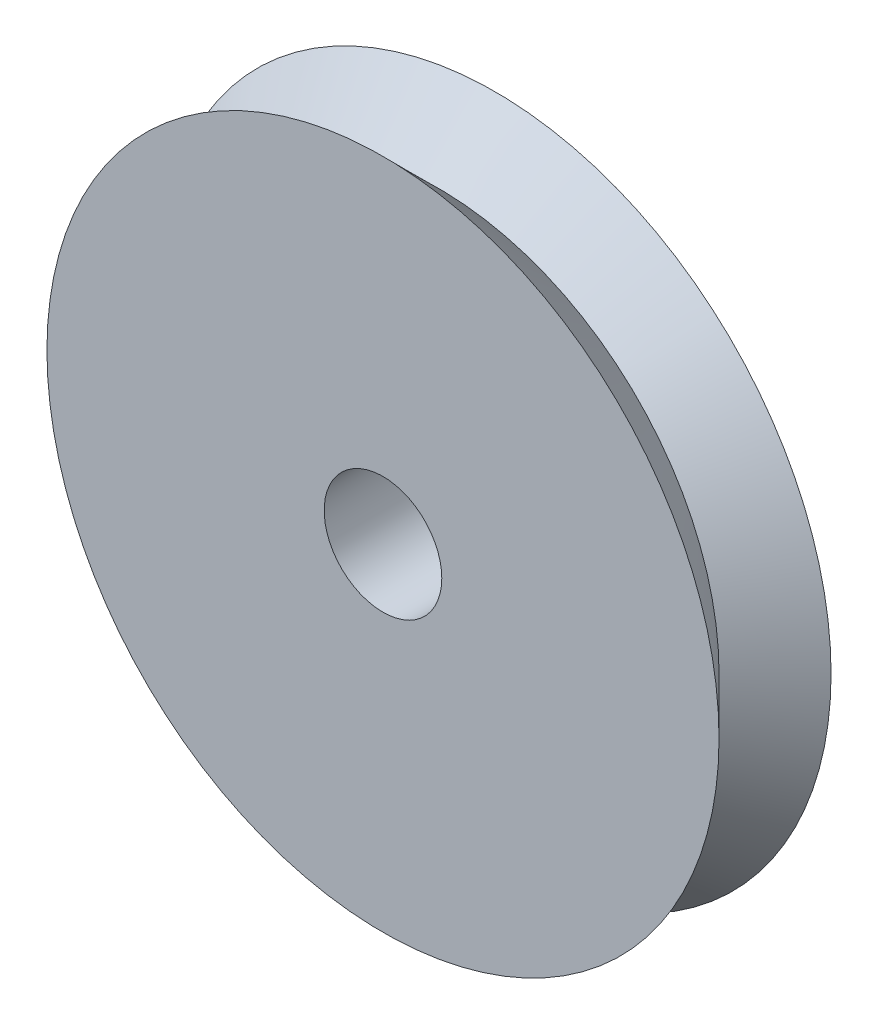
ISO-10303-21;
HEADER;
FILE_DESCRIPTION(('STEP AP214'),'2;1');
FILE_NAME('part.step','',(''),(''),'','','');
FILE_SCHEMA(('AUTOMOTIVE_DESIGN { 1 0 10303 214 1 1 1 1 }'));
ENDSEC;
DATA;
#1=APPLICATION_CONTEXT('core data for automotive mechanical design processes');
#2=APPLICATION_PROTOCOL_DEFINITION('international standard','automotive_design',2000,#1);
#3=PRODUCT_CONTEXT('',#1,'mechanical');
#4=PRODUCT('Part','Part','',(#3));
#5=PRODUCT_RELATED_PRODUCT_CATEGORY('part','',(#4));
#6=PRODUCT_DEFINITION_FORMATION('','',#4);
#7=PRODUCT_DEFINITION_CONTEXT('part definition',#1,'design');
#8=PRODUCT_DEFINITION('design','',#6,#7);
#9=PRODUCT_DEFINITION_SHAPE('','',#8);
#10=(LENGTH_UNIT() NAMED_UNIT(*) SI_UNIT(.MILLI.,.METRE.));
#11=(NAMED_UNIT(*) PLANE_ANGLE_UNIT() SI_UNIT($,.RADIAN.));
#12=(NAMED_UNIT(*) SI_UNIT($,.STERADIAN.) SOLID_ANGLE_UNIT());
#13=UNCERTAINTY_MEASURE_WITH_UNIT(LENGTH_MEASURE(1.E-05),#10,'distance_accuracy_value','');
#14=(GEOMETRIC_REPRESENTATION_CONTEXT(3) GLOBAL_UNCERTAINTY_ASSIGNED_CONTEXT((#13)) GLOBAL_UNIT_ASSIGNED_CONTEXT((#10,
#11,#12)) REPRESENTATION_CONTEXT('',''));
#15=CARTESIAN_POINT('',(0.,0.,0.));
#16=DIRECTION('',(0.,0.,1.));
#17=DIRECTION('',(1.,0.,0.));
#18=AXIS2_PLACEMENT_3D('',#15,#16,#17);
#19=CARTESIAN_POINT('',(0.,0.,-10.));
#20=DIRECTION('',(0.,0.,-1.));
#21=DIRECTION('',(-1.,0.,0.));
#22=AXIS2_PLACEMENT_3D('',#19,#20,#21);
#23=PLANE('',#22);
#24=CARTESIAN_POINT('',(0.,0.,-10.));
#25=DIRECTION('',(0.,0.,1.));
#26=DIRECTION('',(1.,0.,0.));
#27=AXIS2_PLACEMENT_3D('',#24,#25,#26);
#28=CIRCLE('',#27,5.25);
#29=CARTESIAN_POINT('',(5.25,0.,-10.));
#30=VERTEX_POINT('',#29);
#31=EDGE_CURVE('E47',#30,#30,#28,.T.);
#32=ORIENTED_EDGE('',*,*,#31,.T.);
#33=EDGE_LOOP('',(#32));
#34=FACE_BOUND('',#33,.T.);
#35=CARTESIAN_POINT('',(0.,0.,-9.99999999999999));
#36=DIRECTION('',(0.,0.,1.));
#37=DIRECTION('',(1.,0.,0.));
#38=AXIS2_PLACEMENT_3D('',#35,#36,#37);
#39=CIRCLE('',#38,30.);
#40=CARTESIAN_POINT('',(30.,0.,-10.));
#41=VERTEX_POINT('',#40);
#42=EDGE_CURVE('E10',#41,#41,#39,.T.);
#43=ORIENTED_EDGE('',*,*,#42,.F.);
#44=EDGE_LOOP('',(#43));
#45=FACE_BOUND('',#44,.T.);
#46=ADVANCED_FACE('F33',(#34,#45),#23,.T.);
#47=CARTESIAN_POINT('',(0.,0.,-5.));
#48=DIRECTION('',(0.,0.,-1.));
#49=DIRECTION('',(-1.,0.,0.));
#50=AXIS2_PLACEMENT_3D('',#47,#48,#49);
#51=CONICAL_SURFACE('',#50,25.,0.785398163397446);
#52=ORIENTED_EDGE('',*,*,#42,.T.);
#53=EDGE_LOOP('',(#52));
#54=FACE_BOUND('',#53,.T.);
#55=CARTESIAN_POINT('',(0.,0.,-5.));
#56=DIRECTION('',(0.,0.,1.));
#57=DIRECTION('',(1.,0.,0.));
#58=AXIS2_PLACEMENT_3D('',#55,#56,#57);
#59=CIRCLE('',#58,25.);
#60=CARTESIAN_POINT('',(25.,0.,-5.));
#61=VERTEX_POINT('',#60);
#62=EDGE_CURVE('E39',#61,#61,#59,.T.);
#63=ORIENTED_EDGE('',*,*,#62,.F.);
#64=EDGE_LOOP('',(#63));
#65=FACE_BOUND('',#64,.T.);
#66=ADVANCED_FACE('F72',(#54,#65),#51,.T.);
#67=CARTESIAN_POINT('',(0.,0.,-5.));
#68=DIRECTION('',(0.,0.,1.));
#69=DIRECTION('',(1.,0.,0.));
#70=AXIS2_PLACEMENT_3D('',#67,#68,#69);
#71=CONICAL_SURFACE('',#70,25.,0.785398163397447);
#72=CARTESIAN_POINT('',(0.,0.,0.));
#73=DIRECTION('',(0.,0.,1.));
#74=DIRECTION('',(1.,0.,0.));
#75=AXIS2_PLACEMENT_3D('',#72,#73,#74);
#76=CIRCLE('',#75,30.);
#77=CARTESIAN_POINT('',(30.,0.,0.));
#78=VERTEX_POINT('',#77);
#79=EDGE_CURVE('E43',#78,#78,#76,.T.);
#80=ORIENTED_EDGE('',*,*,#79,.F.);
#81=EDGE_LOOP('',(#80));
#82=FACE_BOUND('',#81,.T.);
#83=ORIENTED_EDGE('',*,*,#62,.T.);
#84=EDGE_LOOP('',(#83));
#85=FACE_BOUND('',#84,.T.);
#86=ADVANCED_FACE('F67',(#82,#85),#71,.T.);
#87=CARTESIAN_POINT('',(0.,0.,0.));
#88=DIRECTION('',(0.,0.,-1.));
#89=DIRECTION('',(-1.,0.,0.));
#90=AXIS2_PLACEMENT_3D('',#87,#88,#89);
#91=PLANE('',#90);
#92=CARTESIAN_POINT('',(0.,0.,0.));
#93=DIRECTION('',(0.,0.,1.));
#94=DIRECTION('',(1.,0.,0.));
#95=AXIS2_PLACEMENT_3D('',#92,#93,#94);
#96=CIRCLE('',#95,5.25);
#97=CARTESIAN_POINT('',(5.25,0.,0.));
#98=VERTEX_POINT('',#97);
#99=EDGE_CURVE('E50',#98,#98,#96,.T.);
#100=ORIENTED_EDGE('',*,*,#99,.F.);
#101=EDGE_LOOP('',(#100));
#102=FACE_BOUND('',#101,.T.);
#103=ORIENTED_EDGE('',*,*,#79,.T.);
#104=EDGE_LOOP('',(#103));
#105=FACE_BOUND('',#104,.T.);
#106=ADVANCED_FACE('F61',(#102,#105),#91,.F.);
#107=CARTESIAN_POINT('',(0.,0.,-10.));
#108=DIRECTION('',(0.,0.,1.));
#109=DIRECTION('',(1.,0.,0.));
#110=AXIS2_PLACEMENT_3D('',#107,#108,#109);
#111=CYLINDRICAL_SURFACE('',#110,5.25);
#112=ORIENTED_EDGE('',*,*,#31,.F.);
#113=EDGE_LOOP('',(#112));
#114=FACE_BOUND('',#113,.T.);
#115=ORIENTED_EDGE('',*,*,#99,.T.);
#116=EDGE_LOOP('',(#115));
#117=FACE_BOUND('',#116,.T.);
#118=ADVANCED_FACE('F58',(#114,#117),#111,.F.);
#119=CLOSED_SHELL('',(#46,#66,#86,#106,#118));
#120=MANIFOLD_SOLID_BREP('B2',#119);
#121=ADVANCED_BREP_SHAPE_REPRESENTATION('',(#18,#120),#14);
#122=SHAPE_DEFINITION_REPRESENTATION(#9,#121);
ENDSEC;
END-ISO-10303-21;
